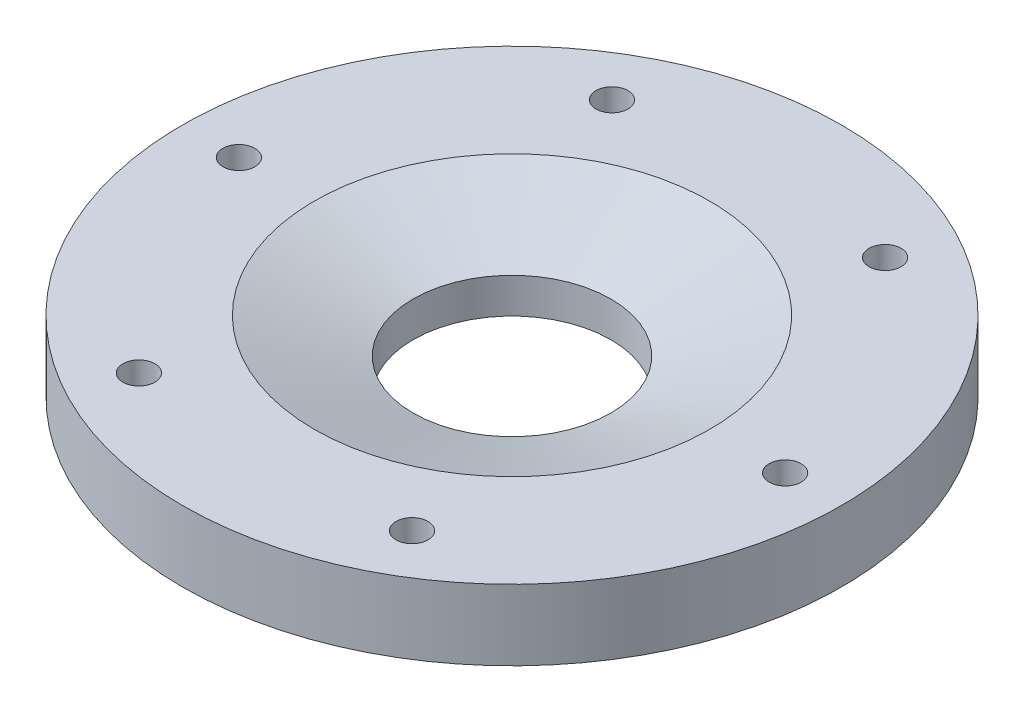
ISO-10303-21;
HEADER;
FILE_DESCRIPTION(('STEP AP214'),'2;1');
FILE_NAME('part.step','',(''),(''),'','','');
FILE_SCHEMA(('AUTOMOTIVE_DESIGN { 1 0 10303 214 1 1 1 1 }'));
ENDSEC;
DATA;
#1=APPLICATION_CONTEXT('core data for automotive mechanical design processes');
#2=APPLICATION_PROTOCOL_DEFINITION('international standard','automotive_design',2000,#1);
#3=PRODUCT_CONTEXT('',#1,'mechanical');
#4=PRODUCT('Part','Part','',(#3));
#5=PRODUCT_RELATED_PRODUCT_CATEGORY('part','',(#4));
#6=PRODUCT_DEFINITION_FORMATION('','',#4);
#7=PRODUCT_DEFINITION_CONTEXT('part definition',#1,'design');
#8=PRODUCT_DEFINITION('design','',#6,#7);
#9=PRODUCT_DEFINITION_SHAPE('','',#8);
#10=(LENGTH_UNIT() NAMED_UNIT(*) SI_UNIT(.MILLI.,.METRE.));
#11=(NAMED_UNIT(*) PLANE_ANGLE_UNIT() SI_UNIT($,.RADIAN.));
#12=(NAMED_UNIT(*) SI_UNIT($,.STERADIAN.) SOLID_ANGLE_UNIT());
#13=UNCERTAINTY_MEASURE_WITH_UNIT(LENGTH_MEASURE(1.E-05),#10,'distance_accuracy_value','');
#14=(GEOMETRIC_REPRESENTATION_CONTEXT(3) GLOBAL_UNCERTAINTY_ASSIGNED_CONTEXT((#13)) GLOBAL_UNIT_ASSIGNED_CONTEXT((#10,
#11,#12)) REPRESENTATION_CONTEXT('',''));
#15=CARTESIAN_POINT('',(0.,0.,0.));
#16=DIRECTION('',(0.,0.,1.));
#17=DIRECTION('',(1.,0.,0.));
#18=AXIS2_PLACEMENT_3D('',#15,#16,#17);
#19=CARTESIAN_POINT('',(-70.,-5.89693422519511,0.));
#20=DIRECTION('',(0.,-1.,0.));
#21=DIRECTION('',(0.,0.,-1.));
#22=AXIS2_PLACEMENT_3D('',#19,#20,#21);
#23=PLANE('',#22);
#24=CARTESIAN_POINT('',(-58.0151650678896,-5.89693422519511,0.));
#25=DIRECTION('',(0.,1.,0.));
#26=DIRECTION('',(0.,0.,1.));
#27=AXIS2_PLACEMENT_3D('',#24,#25,#26);
#28=CIRCLE('',#27,3.39999999999999);
#29=CARTESIAN_POINT('',(-58.0151650678896,-5.89693422519511,3.39999999999999));
#30=VERTEX_POINT('',#29);
#31=EDGE_CURVE('E86',#30,#30,#28,.T.);
#32=ORIENTED_EDGE('',*,*,#31,.T.);
#33=EDGE_LOOP('',(#32));
#34=FACE_BOUND('',#33,.T.);
#35=CARTESIAN_POINT('',(-29.0075825339448,-5.89693422519511,-50.24260675354));
#36=DIRECTION('',(0.,1.,0.));
#37=DIRECTION('',(0.,0.,1.));
#38=AXIS2_PLACEMENT_3D('',#35,#36,#37);
#39=CIRCLE('',#38,3.4);
#40=CARTESIAN_POINT('',(-29.0075825339448,-5.89693422519511,-46.84260675354));
#41=VERTEX_POINT('',#40);
#42=EDGE_CURVE('E80',#41,#41,#39,.T.);
#43=ORIENTED_EDGE('',*,*,#42,.T.);
#44=EDGE_LOOP('',(#43));
#45=FACE_BOUND('',#44,.T.);
#46=CARTESIAN_POINT('',(29.0075825339448,-5.89693422519511,-50.2426067535399));
#47=DIRECTION('',(0.,1.,0.));
#48=DIRECTION('',(0.,0.,1.));
#49=AXIS2_PLACEMENT_3D('',#46,#47,#48);
#50=CIRCLE('',#49,3.39999999999999);
#51=CARTESIAN_POINT('',(29.0075825339448,-5.89693422519511,-46.84260675354));
#52=VERTEX_POINT('',#51);
#53=EDGE_CURVE('E74',#52,#52,#50,.T.);
#54=ORIENTED_EDGE('',*,*,#53,.T.);
#55=EDGE_LOOP('',(#54));
#56=FACE_BOUND('',#55,.T.);
#57=CARTESIAN_POINT('',(58.0151650678896,-5.89693422519511,0.));
#58=DIRECTION('',(0.,1.,0.));
#59=DIRECTION('',(0.,0.,1.));
#60=AXIS2_PLACEMENT_3D('',#57,#58,#59);
#61=CIRCLE('',#60,3.39999999999999);
#62=CARTESIAN_POINT('',(58.0151650678896,-5.89693422519511,3.39999999999999));
#63=VERTEX_POINT('',#62);
#64=EDGE_CURVE('E68',#63,#63,#61,.T.);
#65=ORIENTED_EDGE('',*,*,#64,.T.);
#66=EDGE_LOOP('',(#65));
#67=FACE_BOUND('',#66,.T.);
#68=CARTESIAN_POINT('',(29.0075825339448,-5.89693422519511,50.2426067535399));
#69=DIRECTION('',(0.,1.,0.));
#70=DIRECTION('',(0.,0.,1.));
#71=AXIS2_PLACEMENT_3D('',#68,#69,#70);
#72=CIRCLE('',#71,3.4);
#73=CARTESIAN_POINT('',(29.0075825339448,-5.89693422519511,53.64260675354));
#74=VERTEX_POINT('',#73);
#75=EDGE_CURVE('E62',#74,#74,#72,.T.);
#76=ORIENTED_EDGE('',*,*,#75,.T.);
#77=EDGE_LOOP('',(#76));
#78=FACE_BOUND('',#77,.T.);
#79=CARTESIAN_POINT('',(0.,-5.89693422519511,0.));
#80=DIRECTION('',(0.,1.,0.));
#81=DIRECTION('',(0.,0.,1.));
#82=AXIS2_PLACEMENT_3D('',#79,#80,#81);
#83=CIRCLE('',#82,70.);
#84=CARTESIAN_POINT('',(0.,-5.89693422519511,70.));
#85=VERTEX_POINT('',#84);
#86=EDGE_CURVE('E48',#85,#85,#83,.T.);
#87=ORIENTED_EDGE('',*,*,#86,.F.);
#88=EDGE_LOOP('',(#87));
#89=FACE_BOUND('',#88,.T.);
#90=CARTESIAN_POINT('',(0.,-5.89693422519511,0.));
#91=DIRECTION('',(0.,1.,0.));
#92=DIRECTION('',(0.,0.,1.));
#93=AXIS2_PLACEMENT_3D('',#90,#91,#92);
#94=CIRCLE('',#93,21.);
#95=CARTESIAN_POINT('',(0.,-5.89693422519511,21.));
#96=VERTEX_POINT('',#95);
#97=EDGE_CURVE('E44',#96,#96,#94,.T.);
#98=ORIENTED_EDGE('',*,*,#97,.T.);
#99=EDGE_LOOP('',(#98));
#100=FACE_BOUND('',#99,.T.);
#101=CARTESIAN_POINT('',(-29.0075825339448,-5.89693422519511,50.2426067535399));
#102=DIRECTION('',(0.,1.,0.));
#103=DIRECTION('',(0.,0.,1.));
#104=AXIS2_PLACEMENT_3D('',#101,#102,#103);
#105=CIRCLE('',#104,3.4);
#106=CARTESIAN_POINT('',(-29.0075825339448,-5.89693422519511,53.6426067535399));
#107=VERTEX_POINT('',#106);
#108=EDGE_CURVE('E56',#107,#107,#105,.T.);
#109=ORIENTED_EDGE('',*,*,#108,.T.);
#110=EDGE_LOOP('',(#109));
#111=FACE_BOUND('',#110,.T.);
#112=ADVANCED_FACE('F33',(#34,#45,#56,#67,#78,#89,#100,#111),#23,.T.);
#113=CARTESIAN_POINT('',(-70.,9.10306577480489,0.));
#114=DIRECTION('',(0.,1.,0.));
#115=DIRECTION('',(0.,0.,1.));
#116=AXIS2_PLACEMENT_3D('',#113,#114,#115);
#117=PLANE('',#116);
#118=CARTESIAN_POINT('',(-58.0151650678896,9.10306577480489,0.));
#119=DIRECTION('',(0.,1.,0.));
#120=DIRECTION('',(0.,0.,1.));
#121=AXIS2_PLACEMENT_3D('',#118,#119,#120);
#122=CIRCLE('',#121,3.4);
#123=CARTESIAN_POINT('',(-58.0151650678896,9.10306577480489,3.39999999999999));
#124=VERTEX_POINT('',#123);
#125=EDGE_CURVE('E89',#124,#124,#122,.T.);
#126=ORIENTED_EDGE('',*,*,#125,.F.);
#127=EDGE_LOOP('',(#126));
#128=FACE_BOUND('',#127,.T.);
#129=CARTESIAN_POINT('',(-29.0075825339448,9.10306577480489,-50.24260675354));
#130=DIRECTION('',(0.,1.,0.));
#131=DIRECTION('',(0.,0.,1.));
#132=AXIS2_PLACEMENT_3D('',#129,#130,#131);
#133=CIRCLE('',#132,3.4);
#134=CARTESIAN_POINT('',(-29.0075825339448,9.10306577480489,-46.84260675354));
#135=VERTEX_POINT('',#134);
#136=EDGE_CURVE('E83',#135,#135,#133,.T.);
#137=ORIENTED_EDGE('',*,*,#136,.F.);
#138=EDGE_LOOP('',(#137));
#139=FACE_BOUND('',#138,.T.);
#140=CARTESIAN_POINT('',(29.0075825339448,9.10306577480489,-50.2426067535399));
#141=DIRECTION('',(0.,1.,0.));
#142=DIRECTION('',(0.,0.,1.));
#143=AXIS2_PLACEMENT_3D('',#140,#141,#142);
#144=CIRCLE('',#143,3.4);
#145=CARTESIAN_POINT('',(29.0075825339448,9.10306577480489,-46.8426067535399));
#146=VERTEX_POINT('',#145);
#147=EDGE_CURVE('E77',#146,#146,#144,.T.);
#148=ORIENTED_EDGE('',*,*,#147,.F.);
#149=EDGE_LOOP('',(#148));
#150=FACE_BOUND('',#149,.T.);
#151=CARTESIAN_POINT('',(58.0151650678896,9.10306577480489,0.));
#152=DIRECTION('',(0.,1.,0.));
#153=DIRECTION('',(0.,0.,1.));
#154=AXIS2_PLACEMENT_3D('',#151,#152,#153);
#155=CIRCLE('',#154,3.4);
#156=CARTESIAN_POINT('',(58.0151650678896,9.10306577480489,3.4));
#157=VERTEX_POINT('',#156);
#158=EDGE_CURVE('E71',#157,#157,#155,.T.);
#159=ORIENTED_EDGE('',*,*,#158,.F.);
#160=EDGE_LOOP('',(#159));
#161=FACE_BOUND('',#160,.T.);
#162=CARTESIAN_POINT('',(29.0075825339448,9.10306577480489,50.2426067535399));
#163=DIRECTION('',(0.,1.,0.));
#164=DIRECTION('',(0.,0.,1.));
#165=AXIS2_PLACEMENT_3D('',#162,#163,#164);
#166=CIRCLE('',#165,3.4);
#167=CARTESIAN_POINT('',(29.0075825339448,9.10306577480489,53.64260675354));
#168=VERTEX_POINT('',#167);
#169=EDGE_CURVE('E65',#168,#168,#166,.T.);
#170=ORIENTED_EDGE('',*,*,#169,.F.);
#171=EDGE_LOOP('',(#170));
#172=FACE_BOUND('',#171,.T.);
#173=CARTESIAN_POINT('',(-29.0075825339448,9.10306577480489,50.2426067535399));
#174=DIRECTION('',(0.,1.,0.));
#175=DIRECTION('',(0.,0.,1.));
#176=AXIS2_PLACEMENT_3D('',#173,#174,#175);
#177=CIRCLE('',#176,3.4);
#178=CARTESIAN_POINT('',(-29.0075825339448,9.10306577480489,53.6426067535399));
#179=VERTEX_POINT('',#178);
#180=EDGE_CURVE('E59',#179,#179,#177,.T.);
#181=ORIENTED_EDGE('',*,*,#180,.F.);
#182=EDGE_LOOP('',(#181));
#183=FACE_BOUND('',#182,.T.);
#184=CARTESIAN_POINT('',(0.,9.10306577480489,0.));
#185=DIRECTION('',(0.,1.,0.));
#186=DIRECTION('',(0.,0.,1.));
#187=AXIS2_PLACEMENT_3D('',#184,#185,#186);
#188=CIRCLE('',#187,70.);
#189=CARTESIAN_POINT('',(0.,9.10306577480489,70.));
#190=VERTEX_POINT('',#189);
#191=EDGE_CURVE('E53',#190,#190,#188,.T.);
#192=ORIENTED_EDGE('',*,*,#191,.T.);
#193=EDGE_LOOP('',(#192));
#194=FACE_BOUND('',#193,.T.);
#195=CARTESIAN_POINT('',(0.,9.10306577480489,0.));
#196=DIRECTION('',(0.,1.,0.));
#197=DIRECTION('',(0.,0.,1.));
#198=AXIS2_PLACEMENT_3D('',#195,#196,#197);
#199=CIRCLE('',#198,42.);
#200=CARTESIAN_POINT('',(0.,9.10306577480489,42.));
#201=VERTEX_POINT('',#200);
#202=EDGE_CURVE('E10',#201,#201,#199,.T.);
#203=ORIENTED_EDGE('',*,*,#202,.F.);
#204=EDGE_LOOP('',(#203));
#205=FACE_BOUND('',#204,.T.);
#206=ADVANCED_FACE('F35',(#128,#139,#150,#161,#172,#183,#194,#205),#117,.T.);
#207=CARTESIAN_POINT('',(0.,1.60306577480489,0.));
#208=DIRECTION('',(0.,1.,0.));
#209=DIRECTION('',(0.,0.,1.));
#210=AXIS2_PLACEMENT_3D('',#207,#208,#209);
#211=CONICAL_SURFACE('',#210,21.,1.22777238637419);
#212=ORIENTED_EDGE('',*,*,#202,.T.);
#213=EDGE_LOOP('',(#212));
#214=FACE_BOUND('',#213,.T.);
#215=CARTESIAN_POINT('',(0.,1.60306577480489,0.));
#216=DIRECTION('',(0.,1.,0.));
#217=DIRECTION('',(0.,0.,1.));
#218=AXIS2_PLACEMENT_3D('',#215,#216,#217);
#219=CIRCLE('',#218,21.);
#220=CARTESIAN_POINT('',(0.,1.60306577480489,21.));
#221=VERTEX_POINT('',#220);
#222=EDGE_CURVE('E40',#221,#221,#219,.T.);
#223=ORIENTED_EDGE('',*,*,#222,.F.);
#224=EDGE_LOOP('',(#223));
#225=FACE_BOUND('',#224,.T.);
#226=ADVANCED_FACE('F97',(#214,#225),#211,.F.);
#227=CARTESIAN_POINT('',(0.,48.980657748049,0.));
#228=DIRECTION('',(0.,1.,0.));
#229=DIRECTION('',(0.,0.,1.));
#230=AXIS2_PLACEMENT_3D('',#227,#228,#229);
#231=CYLINDRICAL_SURFACE('',#230,21.);
#232=ORIENTED_EDGE('',*,*,#222,.T.);
#233=EDGE_LOOP('',(#232));
#234=FACE_BOUND('',#233,.T.);
#235=ORIENTED_EDGE('',*,*,#97,.F.);
#236=EDGE_LOOP('',(#235));
#237=FACE_BOUND('',#236,.T.);
#238=ADVANCED_FACE('F114',(#234,#237),#231,.F.);
#239=CARTESIAN_POINT('',(0.,48.980657748049,0.));
#240=DIRECTION('',(0.,1.,0.));
#241=DIRECTION('',(0.,0.,1.));
#242=AXIS2_PLACEMENT_3D('',#239,#240,#241);
#243=CYLINDRICAL_SURFACE('',#242,70.);
#244=ORIENTED_EDGE('',*,*,#86,.T.);
#245=EDGE_LOOP('',(#244));
#246=FACE_BOUND('',#245,.T.);
#247=ORIENTED_EDGE('',*,*,#191,.F.);
#248=EDGE_LOOP('',(#247));
#249=FACE_BOUND('',#248,.T.);
#250=ADVANCED_FACE('F111',(#246,#249),#243,.T.);
#251=CARTESIAN_POINT('',(-29.0075825339448,9.10306577480489,50.2426067535399));
#252=DIRECTION('',(0.,1.,0.));
#253=DIRECTION('',(0.,0.,1.));
#254=AXIS2_PLACEMENT_3D('',#251,#252,#253);
#255=CYLINDRICAL_SURFACE('',#254,3.4);
#256=ORIENTED_EDGE('',*,*,#108,.F.);
#257=EDGE_LOOP('',(#256));
#258=FACE_BOUND('',#257,.T.);
#259=ORIENTED_EDGE('',*,*,#180,.T.);
#260=EDGE_LOOP('',(#259));
#261=FACE_BOUND('',#260,.T.);
#262=ADVANCED_FACE('F113',(#258,#261),#255,.F.);
#263=CARTESIAN_POINT('',(29.0075825339448,9.10306577480489,50.2426067535399));
#264=DIRECTION('',(0.,1.,0.));
#265=DIRECTION('',(0.,0.,1.));
#266=AXIS2_PLACEMENT_3D('',#263,#264,#265);
#267=CYLINDRICAL_SURFACE('',#266,3.4);
#268=ORIENTED_EDGE('',*,*,#75,.F.);
#269=EDGE_LOOP('',(#268));
#270=FACE_BOUND('',#269,.T.);
#271=ORIENTED_EDGE('',*,*,#169,.T.);
#272=EDGE_LOOP('',(#271));
#273=FACE_BOUND('',#272,.T.);
#274=ADVANCED_FACE('F121',(#270,#273),#267,.F.);
#275=CARTESIAN_POINT('',(58.0151650678896,9.10306577480489,0.));
#276=DIRECTION('',(0.,1.,0.));
#277=DIRECTION('',(0.,0.,1.));
#278=AXIS2_PLACEMENT_3D('',#275,#276,#277);
#279=CYLINDRICAL_SURFACE('',#278,3.4);
#280=ORIENTED_EDGE('',*,*,#64,.F.);
#281=EDGE_LOOP('',(#280));
#282=FACE_BOUND('',#281,.T.);
#283=ORIENTED_EDGE('',*,*,#158,.T.);
#284=EDGE_LOOP('',(#283));
#285=FACE_BOUND('',#284,.T.);
#286=ADVANCED_FACE('F170',(#282,#285),#279,.F.);
#287=CARTESIAN_POINT('',(29.0075825339448,9.10306577480489,-50.2426067535399));
#288=DIRECTION('',(0.,1.,0.));
#289=DIRECTION('',(0.,0.,1.));
#290=AXIS2_PLACEMENT_3D('',#287,#288,#289);
#291=CYLINDRICAL_SURFACE('',#290,3.4);
#292=ORIENTED_EDGE('',*,*,#53,.F.);
#293=EDGE_LOOP('',(#292));
#294=FACE_BOUND('',#293,.T.);
#295=ORIENTED_EDGE('',*,*,#147,.T.);
#296=EDGE_LOOP('',(#295));
#297=FACE_BOUND('',#296,.T.);
#298=ADVANCED_FACE('F181',(#294,#297),#291,.F.);
#299=CARTESIAN_POINT('',(-29.0075825339448,9.10306577480489,-50.24260675354));
#300=DIRECTION('',(0.,1.,0.));
#301=DIRECTION('',(0.,0.,1.));
#302=AXIS2_PLACEMENT_3D('',#299,#300,#301);
#303=CYLINDRICAL_SURFACE('',#302,3.4);
#304=ORIENTED_EDGE('',*,*,#42,.F.);
#305=EDGE_LOOP('',(#304));
#306=FACE_BOUND('',#305,.T.);
#307=ORIENTED_EDGE('',*,*,#136,.T.);
#308=EDGE_LOOP('',(#307));
#309=FACE_BOUND('',#308,.T.);
#310=ADVANCED_FACE('F192',(#306,#309),#303,.F.);
#311=CARTESIAN_POINT('',(-58.0151650678896,9.10306577480489,0.));
#312=DIRECTION('',(0.,1.,0.));
#313=DIRECTION('',(0.,0.,1.));
#314=AXIS2_PLACEMENT_3D('',#311,#312,#313);
#315=CYLINDRICAL_SURFACE('',#314,3.4);
#316=ORIENTED_EDGE('',*,*,#31,.F.);
#317=EDGE_LOOP('',(#316));
#318=FACE_BOUND('',#317,.T.);
#319=ORIENTED_EDGE('',*,*,#125,.T.);
#320=EDGE_LOOP('',(#319));
#321=FACE_BOUND('',#320,.T.);
#322=ADVANCED_FACE('F93',(#318,#321),#315,.F.);
#323=CLOSED_SHELL('',(#112,#206,#226,#238,#250,#262,#274,#286,#298,#310,#322));
#324=MANIFOLD_SOLID_BREP('B2',#323);
#325=ADVANCED_BREP_SHAPE_REPRESENTATION('',(#18,#324),#14);
#326=SHAPE_DEFINITION_REPRESENTATION(#9,#325);
ENDSEC;
END-ISO-10303-21;
